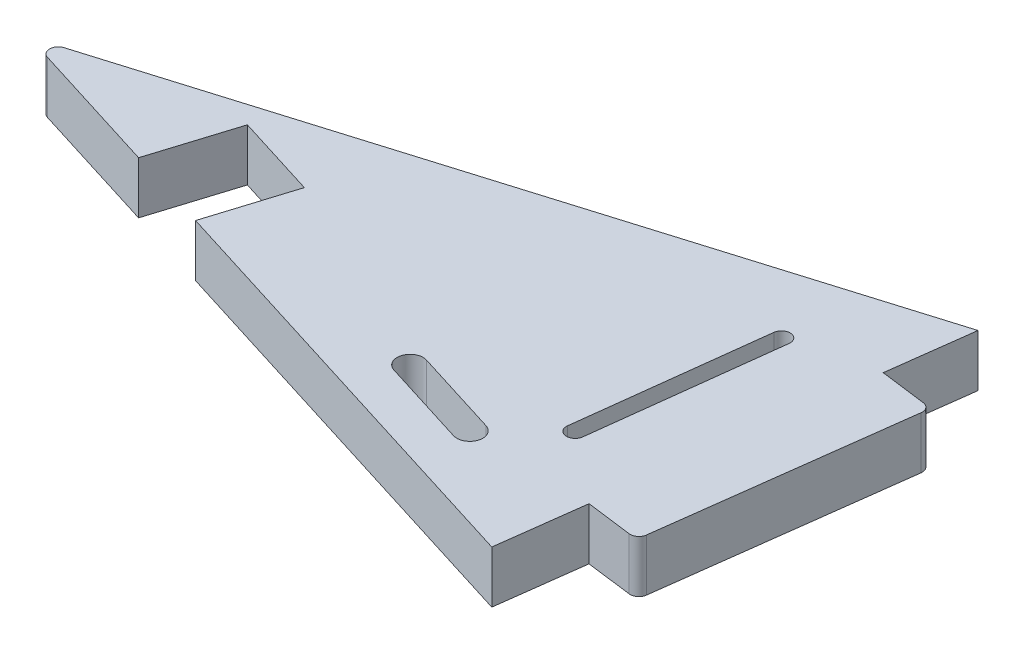
ISO-10303-21;
HEADER;
FILE_DESCRIPTION(('STEP AP214'),'2;1');
FILE_NAME('part.step','',(''),(''),'','','');
FILE_SCHEMA(('AUTOMOTIVE_DESIGN { 1 0 10303 214 1 1 1 1 }'));
ENDSEC;
DATA;
#1=APPLICATION_CONTEXT('core data for automotive mechanical design processes');
#2=APPLICATION_PROTOCOL_DEFINITION('international standard','automotive_design',2000,#1);
#3=PRODUCT_CONTEXT('',#1,'mechanical');
#4=PRODUCT('Part','Part','',(#3));
#5=PRODUCT_RELATED_PRODUCT_CATEGORY('part','',(#4));
#6=PRODUCT_DEFINITION_FORMATION('','',#4);
#7=PRODUCT_DEFINITION_CONTEXT('part definition',#1,'design');
#8=PRODUCT_DEFINITION('design','',#6,#7);
#9=PRODUCT_DEFINITION_SHAPE('','',#8);
#10=(LENGTH_UNIT() NAMED_UNIT(*) SI_UNIT(.MILLI.,.METRE.));
#11=(NAMED_UNIT(*) PLANE_ANGLE_UNIT() SI_UNIT($,.RADIAN.));
#12=(NAMED_UNIT(*) SI_UNIT($,.STERADIAN.) SOLID_ANGLE_UNIT());
#13=UNCERTAINTY_MEASURE_WITH_UNIT(LENGTH_MEASURE(1.E-05),#10,'distance_accuracy_value','');
#14=(GEOMETRIC_REPRESENTATION_CONTEXT(3) GLOBAL_UNCERTAINTY_ASSIGNED_CONTEXT((#13)) GLOBAL_UNIT_ASSIGNED_CONTEXT((#10,
#11,#12)) REPRESENTATION_CONTEXT('',''));
#15=CARTESIAN_POINT('',(0.,0.,0.));
#16=DIRECTION('',(0.,0.,1.));
#17=DIRECTION('',(1.,0.,0.));
#18=AXIS2_PLACEMENT_3D('',#15,#16,#17);
#19=CARTESIAN_POINT('',(-50.5622453656536,6.,-14.8094018421724));
#20=DIRECTION('',(0.298274993135946,0.,-0.95447997803503));
#21=DIRECTION('',(-0.95447997803503,0.,-0.298274993135946));
#22=AXIS2_PLACEMENT_3D('',#19,#20,#21);
#23=PLANE('',#22);
#24=DIRECTION('',(0.95447997803503,0.,0.298274993135946));
#25=VECTOR('',#24,1.);
#26=CARTESIAN_POINT('',(-50.5622453656536,0.,-14.8094018421724));
#27=LINE('',#26,#25);
#28=CARTESIAN_POINT('',(-77.0169682754077,0.,-23.0765027514706));
#29=VERTEX_POINT('',#28);
#30=CARTESIAN_POINT('',(-61.7452886268472,0.,-18.3041028612954));
#31=VERTEX_POINT('',#30);
#32=EDGE_CURVE('E315',#29,#31,#27,.T.);
#33=ORIENTED_EDGE('',*,*,#32,.T.);
#34=DIRECTION('',(0.,1.,0.));
#35=VECTOR('',#34,1.);
#36=CARTESIAN_POINT('',(-61.7452886268472,0.,-18.3041028612954));
#37=LINE('',#36,#35);
#38=CARTESIAN_POINT('',(-61.7452886268472,6.,-18.3041028612954));
#39=VERTEX_POINT('',#38);
#40=EDGE_CURVE('E217',#31,#39,#37,.T.);
#41=ORIENTED_EDGE('',*,*,#40,.T.);
#42=DIRECTION('',(0.95447997803503,0.,0.298274993135946));
#43=VECTOR('',#42,1.);
#44=CARTESIAN_POINT('',(-40.8702016635647,6.,-11.7806381852697));
#45=LINE('',#44,#43);
#46=CARTESIAN_POINT('',(-77.0169682754077,6.,-23.0765027514706));
#47=VERTEX_POINT('',#46);
#48=EDGE_CURVE('E281',#47,#39,#45,.T.);
#49=ORIENTED_EDGE('',*,*,#48,.F.);
#50=DIRECTION('',(0.,-1.,0.));
#51=VECTOR('',#50,1.);
#52=CARTESIAN_POINT('',(-77.0169682754077,6.,-23.0765027514706));
#53=LINE('',#52,#51);
#54=EDGE_CURVE('E329',#47,#29,#53,.T.);
#55=ORIENTED_EDGE('',*,*,#54,.T.);
#56=EDGE_LOOP('',(#33,#41,#49,#55));
#57=FACE_BOUND('',#56,.T.);
#58=ADVANCED_FACE('F33',(#57),#23,.F.);
#59=CARTESIAN_POINT('',(0.,6.,0.));
#60=DIRECTION('',(0.,1.,0.));
#61=DIRECTION('',(0.,0.,1.));
#62=AXIS2_PLACEMENT_3D('',#59,#60,#61);
#63=PLANE('',#62);
#64=DIRECTION('',(-0.298274993135947,0.,0.95447997803503));
#65=VECTOR('',#64,1.);
#66=CARTESIAN_POINT('',(-61.7452886268472,6.,-18.3041028612954));
#67=LINE('',#66,#65);
#68=CARTESIAN_POINT('',(-58.7625386954878,6.,-27.8489026416457));
#69=VERTEX_POINT('',#68);
#70=EDGE_CURVE('E208',#69,#39,#67,.T.);
#71=ORIENTED_EDGE('',*,*,#70,.F.);
#72=DIRECTION('',(-0.95447997803503,0.,-0.298274993135947));
#73=VECTOR('',#72,1.);
#74=CARTESIAN_POINT('',(-58.7625386954878,6.,-27.8489026416457));
#75=LINE('',#74,#73);
#76=CARTESIAN_POINT('',(-49.2177389151375,6.,-24.8661527102863));
#77=VERTEX_POINT('',#76);
#78=EDGE_CURVE('E210',#77,#69,#75,.T.);
#79=ORIENTED_EDGE('',*,*,#78,.F.);
#80=DIRECTION('',(0.298274993135947,0.,-0.95447997803503));
#81=VECTOR('',#80,1.);
#82=CARTESIAN_POINT('',(-49.2177389151375,6.,-24.8661527102863));
#83=LINE('',#82,#81);
#84=CARTESIAN_POINT('',(-52.2004888464969,6.,-15.321352929936));
#85=VERTEX_POINT('',#84);
#86=EDGE_CURVE('E188',#85,#77,#83,.T.);
#87=ORIENTED_EDGE('',*,*,#86,.F.);
#88=CARTESIAN_POINT('',(-2.58662904031351,6.,0.182978259496312));
#89=VERTEX_POINT('',#88);
#90=EDGE_CURVE('E285',#85,#89,#45,.T.);
#91=ORIENTED_EDGE('',*,*,#90,.T.);
#92=DIRECTION('',(0.127999816964584,0.,-0.991774191465493));
#93=VECTOR('',#92,1.);
#94=CARTESIAN_POINT('',(-2.58662904031351,6.,0.182978259496312));
#95=LINE('',#94,#93);
#96=CARTESIAN_POINT('',(-1.30663087066766,6.,-9.73476365515862));
#97=VERTEX_POINT('',#96);
#98=EDGE_CURVE('E284',#89,#97,#95,.T.);
#99=ORIENTED_EDGE('',*,*,#98,.T.);
#100=DIRECTION('',(0.991774191465493,0.,0.127999816964584));
#101=VECTOR('',#100,1.);
#102=CARTESIAN_POINT('',(4.99113524513822,6.,-8.92196481743351));
#103=LINE('',#102,#101);
#104=CARTESIAN_POINT('',(3.99935448218416,6.,-9.04996548252395));
#105=VERTEX_POINT('',#104);
#106=EDGE_CURVE('E287',#97,#105,#103,.T.);
#107=ORIENTED_EDGE('',*,*,#106,.T.);
#108=CARTESIAN_POINT('',(4.12735429914875,6.,-10.0417396739894));
#109=DIRECTION('',(0.,1.,0.));
#110=DIRECTION('',(0.,0.,1.));
#111=AXIS2_PLACEMENT_3D('',#108,#109,#110);
#112=CIRCLE('',#111,1.);
#113=CARTESIAN_POINT('',(5.11912933871551,6.,-9.91374642849446));
#114=VERTEX_POINT('',#113);
#115=EDGE_CURVE('E342',#105,#114,#112,.T.);
#116=ORIENTED_EDGE('',*,*,#115,.T.);
#117=DIRECTION('',(0.127993245494982,0.,-0.991775039566766));
#118=VECTOR('',#117,1.);
#119=CARTESIAN_POINT('',(8.86277670782997,6.,-38.9219648174335));
#120=LINE('',#119,#118);
#121=CARTESIAN_POINT('',(8.73478431041168,6.,-37.9301963493174));
#122=VERTEX_POINT('',#121);
#123=EDGE_CURVE('E290',#114,#122,#120,.T.);
#124=ORIENTED_EDGE('',*,*,#123,.T.);
#125=CARTESIAN_POINT('',(7.74300927084491,6.,-38.0581895948124));
#126=DIRECTION('',(0.,1.,0.));
#127=DIRECTION('',(0.,0.,1.));
#128=AXIS2_PLACEMENT_3D('',#125,#126,#127);
#129=CIRCLE('',#128,1.);
#130=CARTESIAN_POINT('',(7.8710090878095,6.,-39.0499637862779));
#131=VERTEX_POINT('',#130);
#132=EDGE_CURVE('E340',#122,#131,#129,.T.);
#133=ORIENTED_EDGE('',*,*,#132,.T.);
#134=DIRECTION('',(-0.991774191465493,0.,-0.127999816964585));
#135=VECTOR('',#134,1.);
#136=CARTESIAN_POINT('',(2.56520937097691,6.,-39.7347380004584));
#137=LINE('',#136,#135);
#138=CARTESIAN_POINT('',(2.56520937097691,6.,-39.7347380004584));
#139=VERTEX_POINT('',#138);
#140=EDGE_CURVE('E293',#131,#139,#137,.T.);
#141=ORIENTED_EDGE('',*,*,#140,.T.);
#142=DIRECTION('',(0.127999816964585,0.,-0.991774191465493));
#143=VECTOR('',#142,1.);
#144=CARTESIAN_POINT('',(2.56520937097691,6.,-39.7347380004584));
#145=LINE('',#144,#143);
#146=CARTESIAN_POINT('',(3.81336180791572,6.,-49.4057313137783));
#147=VERTEX_POINT('',#146);
#148=EDGE_CURVE('E295',#139,#147,#145,.T.);
#149=ORIENTED_EDGE('',*,*,#148,.T.);
#150=DIRECTION('',(-0.957266703629105,0.,0.289206601105625));
#151=VECTOR('',#150,1.);
#152=CARTESIAN_POINT('',(3.81336180791572,6.,-49.4057313137783));
#153=LINE('',#152,#151);
#154=CARTESIAN_POINT('',(-77.0078998833774,6.,-24.9882494331347));
#155=VERTEX_POINT('',#154);
#156=EDGE_CURVE('E297',#147,#155,#153,.T.);
#157=ORIENTED_EDGE('',*,*,#156,.T.);
#158=CARTESIAN_POINT('',(-76.7186932822718,6.,-24.0309827295056));
#159=DIRECTION('',(0.,1.,0.));
#160=DIRECTION('',(0.,0.,1.));
#161=AXIS2_PLACEMENT_3D('',#158,#159,#160);
#162=CIRCLE('',#161,1.);
#163=EDGE_CURVE('E344',#155,#47,#162,.T.);
#164=ORIENTED_EDGE('',*,*,#163,.T.);
#165=ORIENTED_EDGE('',*,*,#48,.T.);
#166=EDGE_LOOP('',(#71,#79,#87,#91,#99,#107,#116,#124,#133,#141,#149,#157,#164,#165));
#167=FACE_BOUND('',#166,.T.);
#168=CARTESIAN_POINT('',(-25.4485710643365,6.,-13.2733837193548));
#169=DIRECTION('',(0.,1.,0.));
#170=DIRECTION('',(0.,0.,1.));
#171=AXIS2_PLACEMENT_3D('',#168,#169,#170);
#172=CIRCLE('',#171,1.5);
#173=CARTESIAN_POINT('',(-25.0011585746325,6.,-14.7051036864073));
#174=VERTEX_POINT('',#173);
#175=CARTESIAN_POINT('',(-25.8959835540404,6.,-11.8416637523022));
#176=VERTEX_POINT('',#175);
#177=EDGE_CURVE('E48',#174,#176,#172,.T.);
#178=ORIENTED_EDGE('',*,*,#177,.F.);
#179=DIRECTION('',(-0.95447997803503,0.,-0.298274993135946));
#180=VECTOR('',#179,1.);
#181=CARTESIAN_POINT('',(-25.0011585746325,6.,-14.7051036864073));
#182=LINE('',#181,#180);
#183=CARTESIAN_POINT('',(-15.0011585746325,6.,-11.5801036864073));
#184=VERTEX_POINT('',#183);
#185=EDGE_CURVE('E227',#184,#174,#182,.T.);
#186=ORIENTED_EDGE('',*,*,#185,.F.);
#187=CARTESIAN_POINT('',(-15.4485710643365,6.,-10.1483837193548));
#188=DIRECTION('',(0.,1.,0.));
#189=DIRECTION('',(0.,0.,1.));
#190=AXIS2_PLACEMENT_3D('',#187,#188,#189);
#191=CIRCLE('',#190,1.5);
#192=CARTESIAN_POINT('',(-15.8959835540404,6.,-8.71666375230222));
#193=VERTEX_POINT('',#192);
#194=EDGE_CURVE('E239',#193,#184,#191,.T.);
#195=ORIENTED_EDGE('',*,*,#194,.F.);
#196=DIRECTION('',(0.95447997803503,0.,0.298274993135946));
#197=VECTOR('',#196,1.);
#198=CARTESIAN_POINT('',(-25.8959835540404,6.,-11.8416637523022));
#199=LINE('',#198,#197);
#200=EDGE_CURVE('E236',#176,#193,#199,.T.);
#201=ORIENTED_EDGE('',*,*,#200,.F.);
#202=EDGE_LOOP('',(#178,#186,#195,#201));
#203=FACE_BOUND('',#202,.T.);
#204=DIRECTION('',(-0.119933388837498,0.,0.992781940932627));
#205=VECTOR('',#204,1.);
#206=CARTESIAN_POINT('',(-7.75124107632382,6.,-37.4710303543429));
#207=LINE('',#206,#205);
#208=CARTESIAN_POINT('',(-7.75124107632382,6.,-37.4710303543429));
#209=VERTEX_POINT('',#208);
#210=CARTESIAN_POINT('',(-10.3126104313028,6.,-16.2685840270169));
#211=VERTEX_POINT('',#210);
#212=EDGE_CURVE('E252',#209,#211,#207,.T.);
#213=ORIENTED_EDGE('',*,*,#212,.F.);
#214=CARTESIAN_POINT('',(-6.75845913539119,6.,-37.3510969655054));
#215=DIRECTION('',(0.,1.,0.));
#216=DIRECTION('',(0.,0.,1.));
#217=AXIS2_PLACEMENT_3D('',#214,#215,#216);
#218=CIRCLE('',#217,1.);
#219=CARTESIAN_POINT('',(-5.76567719445857,6.,-37.2311635766679));
#220=VERTEX_POINT('',#219);
#221=EDGE_CURVE('E250',#220,#209,#218,.T.);
#222=ORIENTED_EDGE('',*,*,#221,.F.);
#223=DIRECTION('',(0.119933388837498,0.,-0.992781940932627));
#224=VECTOR('',#223,1.);
#225=CARTESIAN_POINT('',(-5.76567719445857,6.,-37.2311635766679));
#226=LINE('',#225,#224);
#227=CARTESIAN_POINT('',(-8.32704654943754,6.,-16.0287172493419));
#228=VERTEX_POINT('',#227);
#229=EDGE_CURVE('E258',#228,#220,#226,.T.);
#230=ORIENTED_EDGE('',*,*,#229,.F.);
#231=CARTESIAN_POINT('',(-9.31982849037016,6.,-16.1486506381794));
#232=DIRECTION('',(0.,1.,0.));
#233=DIRECTION('',(0.,0.,1.));
#234=AXIS2_PLACEMENT_3D('',#231,#232,#233);
#235=CIRCLE('',#234,1.);
#236=EDGE_CURVE('E255',#211,#228,#235,.T.);
#237=ORIENTED_EDGE('',*,*,#236,.F.);
#238=EDGE_LOOP('',(#213,#222,#230,#237));
#239=FACE_BOUND('',#238,.T.);
#240=ADVANCED_FACE('F359',(#167,#203,#239),#63,.T.);
#241=CARTESIAN_POINT('',(0.,0.,0.));
#242=DIRECTION('',(0.,1.,0.));
#243=DIRECTION('',(0.,0.,1.));
#244=AXIS2_PLACEMENT_3D('',#241,#242,#243);
#245=PLANE('',#244);
#246=DIRECTION('',(-0.95447997803503,0.,-0.298274993135946));
#247=VECTOR('',#246,1.);
#248=CARTESIAN_POINT('',(-25.0011585746325,0.,-14.7051036864073));
#249=LINE('',#248,#247);
#250=CARTESIAN_POINT('',(-15.0011585746325,0.,-11.5801036864073));
#251=VERTEX_POINT('',#250);
#252=CARTESIAN_POINT('',(-25.0011585746325,0.,-14.7051036864073));
#253=VERTEX_POINT('',#252);
#254=EDGE_CURVE('E231',#251,#253,#249,.T.);
#255=ORIENTED_EDGE('',*,*,#254,.T.);
#256=CARTESIAN_POINT('',(-25.4485710643365,0.,-13.2733837193548));
#257=DIRECTION('',(0.,1.,0.));
#258=DIRECTION('',(0.,0.,1.));
#259=AXIS2_PLACEMENT_3D('',#256,#257,#258);
#260=CIRCLE('',#259,1.5);
#261=CARTESIAN_POINT('',(-25.8959835540404,0.,-11.8416637523022));
#262=VERTEX_POINT('',#261);
#263=EDGE_CURVE('E223',#253,#262,#260,.T.);
#264=ORIENTED_EDGE('',*,*,#263,.T.);
#265=DIRECTION('',(0.95447997803503,0.,0.298274993135946));
#266=VECTOR('',#265,1.);
#267=CARTESIAN_POINT('',(-25.8959835540404,0.,-11.8416637523022));
#268=LINE('',#267,#266);
#269=CARTESIAN_POINT('',(-15.8959835540404,0.,-8.71666375230222));
#270=VERTEX_POINT('',#269);
#271=EDGE_CURVE('E226',#262,#270,#268,.T.);
#272=ORIENTED_EDGE('',*,*,#271,.T.);
#273=CARTESIAN_POINT('',(-15.4485710643365,0.,-10.1483837193548));
#274=DIRECTION('',(0.,1.,0.));
#275=DIRECTION('',(0.,0.,1.));
#276=AXIS2_PLACEMENT_3D('',#273,#274,#275);
#277=CIRCLE('',#276,1.5);
#278=EDGE_CURVE('E56',#270,#251,#277,.T.);
#279=ORIENTED_EDGE('',*,*,#278,.T.);
#280=EDGE_LOOP('',(#255,#264,#272,#279));
#281=FACE_BOUND('',#280,.T.);
#282=DIRECTION('',(-0.95447997803503,0.,-0.298274993135947));
#283=VECTOR('',#282,1.);
#284=CARTESIAN_POINT('',(-58.7625386954878,0.,-27.8489026416457));
#285=LINE('',#284,#283);
#286=CARTESIAN_POINT('',(-49.2177389151375,0.,-24.8661527102863));
#287=VERTEX_POINT('',#286);
#288=CARTESIAN_POINT('',(-58.7625386954878,0.,-27.8489026416457));
#289=VERTEX_POINT('',#288);
#290=EDGE_CURVE('E196',#287,#289,#285,.T.);
#291=ORIENTED_EDGE('',*,*,#290,.T.);
#292=DIRECTION('',(-0.298274993135947,0.,0.95447997803503));
#293=VECTOR('',#292,1.);
#294=CARTESIAN_POINT('',(-61.7452886268472,0.,-18.3041028612954));
#295=LINE('',#294,#293);
#296=EDGE_CURVE('E201',#289,#31,#295,.T.);
#297=ORIENTED_EDGE('',*,*,#296,.T.);
#298=ORIENTED_EDGE('',*,*,#32,.F.);
#299=CARTESIAN_POINT('',(-76.7186932822718,0.,-24.0309827295056));
#300=DIRECTION('',(0.,1.,0.));
#301=DIRECTION('',(0.,0.,1.));
#302=AXIS2_PLACEMENT_3D('',#299,#300,#301);
#303=CIRCLE('',#302,1.);
#304=CARTESIAN_POINT('',(-77.0078998833774,0.,-24.9882494331347));
#305=VERTEX_POINT('',#304);
#306=EDGE_CURVE('E336',#29,#305,#303,.F.);
#307=ORIENTED_EDGE('',*,*,#306,.T.);
#308=DIRECTION('',(-0.957266703629105,0.,0.289206601105625));
#309=VECTOR('',#308,1.);
#310=CARTESIAN_POINT('',(3.81336180791572,0.,-49.4057313137783));
#311=LINE('',#310,#309);
#312=CARTESIAN_POINT('',(3.81336180791572,0.,-49.4057313137783));
#313=VERTEX_POINT('',#312);
#314=EDGE_CURVE('E312',#313,#305,#311,.T.);
#315=ORIENTED_EDGE('',*,*,#314,.F.);
#316=DIRECTION('',(0.127999816964585,0.,-0.991774191465493));
#317=VECTOR('',#316,1.);
#318=CARTESIAN_POINT('',(2.56520937097691,0.,-39.7347380004584));
#319=LINE('',#318,#317);
#320=CARTESIAN_POINT('',(2.56520937097691,0.,-39.7347380004584));
#321=VERTEX_POINT('',#320);
#322=EDGE_CURVE('E310',#321,#313,#319,.T.);
#323=ORIENTED_EDGE('',*,*,#322,.F.);
#324=DIRECTION('',(-0.991774191465493,0.,-0.127999816964585));
#325=VECTOR('',#324,1.);
#326=CARTESIAN_POINT('',(2.56520937097691,0.,-39.7347380004584));
#327=LINE('',#326,#325);
#328=CARTESIAN_POINT('',(7.8710090878095,0.,-39.0499637862779));
#329=VERTEX_POINT('',#328);
#330=EDGE_CURVE('E308',#329,#321,#327,.T.);
#331=ORIENTED_EDGE('',*,*,#330,.F.);
#332=CARTESIAN_POINT('',(7.74300927084491,0.,-38.0581895948124));
#333=DIRECTION('',(0.,1.,0.));
#334=DIRECTION('',(0.,0.,1.));
#335=AXIS2_PLACEMENT_3D('',#332,#333,#334);
#336=CIRCLE('',#335,1.);
#337=CARTESIAN_POINT('',(8.73478431041168,0.,-37.9301963493174));
#338=VERTEX_POINT('',#337);
#339=EDGE_CURVE('E332',#329,#338,#336,.F.);
#340=ORIENTED_EDGE('',*,*,#339,.T.);
#341=DIRECTION('',(0.127993245494982,0.,-0.991775039566766));
#342=VECTOR('',#341,1.);
#343=CARTESIAN_POINT('',(8.86277670782997,0.,-38.9219648174335));
#344=LINE('',#343,#342);
#345=CARTESIAN_POINT('',(5.11912933871551,0.,-9.91374642849446));
#346=VERTEX_POINT('',#345);
#347=EDGE_CURVE('E305',#346,#338,#344,.T.);
#348=ORIENTED_EDGE('',*,*,#347,.F.);
#349=CARTESIAN_POINT('',(4.12735429914875,0.,-10.0417396739894));
#350=DIRECTION('',(0.,1.,0.));
#351=DIRECTION('',(0.,0.,1.));
#352=AXIS2_PLACEMENT_3D('',#349,#350,#351);
#353=CIRCLE('',#352,1.);
#354=CARTESIAN_POINT('',(3.99935448218416,0.,-9.04996548252395));
#355=VERTEX_POINT('',#354);
#356=EDGE_CURVE('E334',#346,#355,#353,.F.);
#357=ORIENTED_EDGE('',*,*,#356,.T.);
#358=DIRECTION('',(0.991774191465493,0.,0.127999816964584));
#359=VECTOR('',#358,1.);
#360=CARTESIAN_POINT('',(4.99113524513822,0.,-8.92196481743351));
#361=LINE('',#360,#359);
#362=CARTESIAN_POINT('',(-1.30663087066766,0.,-9.73476365515862));
#363=VERTEX_POINT('',#362);
#364=EDGE_CURVE('E302',#363,#355,#361,.T.);
#365=ORIENTED_EDGE('',*,*,#364,.F.);
#366=DIRECTION('',(0.127999816964584,0.,-0.991774191465493));
#367=VECTOR('',#366,1.);
#368=CARTESIAN_POINT('',(-2.58662904031351,0.,0.182978259496312));
#369=LINE('',#368,#367);
#370=CARTESIAN_POINT('',(-2.58662904031351,0.,0.182978259496312));
#371=VERTEX_POINT('',#370);
#372=EDGE_CURVE('E280',#371,#363,#369,.T.);
#373=ORIENTED_EDGE('',*,*,#372,.F.);
#374=CARTESIAN_POINT('',(-52.2004888464969,0.,-15.321352929936));
#375=VERTEX_POINT('',#374);
#376=EDGE_CURVE('E207',#375,#371,#27,.T.);
#377=ORIENTED_EDGE('',*,*,#376,.F.);
#378=DIRECTION('',(0.298274993135947,0.,-0.95447997803503));
#379=VECTOR('',#378,1.);
#380=CARTESIAN_POINT('',(-49.2177389151375,0.,-24.8661527102863));
#381=LINE('',#380,#379);
#382=EDGE_CURVE('E185',#375,#287,#381,.T.);
#383=ORIENTED_EDGE('',*,*,#382,.T.);
#384=EDGE_LOOP('',(#291,#297,#298,#307,#315,#323,#331,#340,#348,#357,#365,#373,#377,#383));
#385=FACE_BOUND('',#384,.T.);
#386=CARTESIAN_POINT('',(-6.75845913539119,0.,-37.3510969655054));
#387=DIRECTION('',(0.,1.,0.));
#388=DIRECTION('',(0.,0.,1.));
#389=AXIS2_PLACEMENT_3D('',#386,#387,#388);
#390=CIRCLE('',#389,1.);
#391=CARTESIAN_POINT('',(-5.76567719445857,0.,-37.2311635766679));
#392=VERTEX_POINT('',#391);
#393=CARTESIAN_POINT('',(-7.75124107632382,0.,-37.4710303543429));
#394=VERTEX_POINT('',#393);
#395=EDGE_CURVE('E220',#392,#394,#390,.T.);
#396=ORIENTED_EDGE('',*,*,#395,.T.);
#397=DIRECTION('',(-0.119933388837498,0.,0.992781940932627));
#398=VECTOR('',#397,1.);
#399=CARTESIAN_POINT('',(-7.75124107632382,0.,-37.4710303543429));
#400=LINE('',#399,#398);
#401=CARTESIAN_POINT('',(-10.3126104313028,0.,-16.2685840270169));
#402=VERTEX_POINT('',#401);
#403=EDGE_CURVE('E263',#394,#402,#400,.T.);
#404=ORIENTED_EDGE('',*,*,#403,.T.);
#405=CARTESIAN_POINT('',(-9.31982849037016,0.,-16.1486506381794));
#406=DIRECTION('',(0.,1.,0.));
#407=DIRECTION('',(0.,0.,1.));
#408=AXIS2_PLACEMENT_3D('',#405,#406,#407);
#409=CIRCLE('',#408,1.);
#410=CARTESIAN_POINT('',(-8.32704654943754,0.,-16.0287172493419));
#411=VERTEX_POINT('',#410);
#412=EDGE_CURVE('E266',#402,#411,#409,.T.);
#413=ORIENTED_EDGE('',*,*,#412,.T.);
#414=DIRECTION('',(0.119933388837498,0.,-0.992781940932627));
#415=VECTOR('',#414,1.);
#416=CARTESIAN_POINT('',(-5.76567719445857,0.,-37.2311635766679));
#417=LINE('',#416,#415);
#418=EDGE_CURVE('E253',#411,#392,#417,.T.);
#419=ORIENTED_EDGE('',*,*,#418,.T.);
#420=EDGE_LOOP('',(#396,#404,#413,#419));
#421=FACE_BOUND('',#420,.T.);
#422=ADVANCED_FACE('F204',(#281,#385,#421),#245,.F.);
#423=CARTESIAN_POINT('',(-2.58662904031351,6.,0.182978259496312));
#424=DIRECTION('',(-0.991774191465493,0.,-0.127999816964584));
#425=DIRECTION('',(-0.127999816964584,0.,0.991774191465493));
#426=AXIS2_PLACEMENT_3D('',#423,#424,#425);
#427=PLANE('',#426);
#428=ORIENTED_EDGE('',*,*,#372,.T.);
#429=DIRECTION('',(0.,-1.,0.));
#430=VECTOR('',#429,1.);
#431=CARTESIAN_POINT('',(-1.30663087066766,6.,-9.73476365515862));
#432=LINE('',#431,#430);
#433=EDGE_CURVE('E323',#97,#363,#432,.T.);
#434=ORIENTED_EDGE('',*,*,#433,.F.);
#435=ORIENTED_EDGE('',*,*,#98,.F.);
#436=DIRECTION('',(0.,-1.,0.));
#437=VECTOR('',#436,1.);
#438=CARTESIAN_POINT('',(-2.58662904031351,6.,0.182978259496312));
#439=LINE('',#438,#437);
#440=EDGE_CURVE('E326',#89,#371,#439,.T.);
#441=ORIENTED_EDGE('',*,*,#440,.T.);
#442=EDGE_LOOP('',(#428,#434,#435,#441));
#443=FACE_BOUND('',#442,.T.);
#444=ADVANCED_FACE('F402',(#443),#427,.F.);
#445=CARTESIAN_POINT('',(4.99113524513822,6.,-8.92196481743351));
#446=DIRECTION('',(0.127999816964584,0.,-0.991774191465493));
#447=DIRECTION('',(-0.991774191465493,0.,-0.127999816964584));
#448=AXIS2_PLACEMENT_3D('',#445,#446,#447);
#449=PLANE('',#448);
#450=ORIENTED_EDGE('',*,*,#364,.T.);
#451=DIRECTION('',(0.,-1.,0.));
#452=VECTOR('',#451,1.);
#453=CARTESIAN_POINT('',(3.99935448218416,6.,-9.04996548252395));
#454=LINE('',#453,#452);
#455=EDGE_CURVE('E41',#355,#105,#454,.F.);
#456=ORIENTED_EDGE('',*,*,#455,.T.);
#457=ORIENTED_EDGE('',*,*,#106,.F.);
#458=ORIENTED_EDGE('',*,*,#433,.T.);
#459=EDGE_LOOP('',(#450,#456,#457,#458));
#460=FACE_BOUND('',#459,.T.);
#461=ADVANCED_FACE('F353',(#460),#449,.F.);
#462=CARTESIAN_POINT('',(8.86277670782997,6.,-38.9219648174335));
#463=DIRECTION('',(-0.991775039566766,0.,-0.127993245494982));
#464=DIRECTION('',(-0.127993245494982,0.,0.991775039566767));
#465=AXIS2_PLACEMENT_3D('',#462,#463,#464);
#466=PLANE('',#465);
#467=ORIENTED_EDGE('',*,*,#123,.F.);
#468=DIRECTION('',(0.,-1.,0.));
#469=VECTOR('',#468,1.);
#470=CARTESIAN_POINT('',(5.11912933871551,6.,-9.91374642849446));
#471=LINE('',#470,#469);
#472=EDGE_CURVE('E348',#114,#346,#471,.T.);
#473=ORIENTED_EDGE('',*,*,#472,.T.);
#474=ORIENTED_EDGE('',*,*,#347,.T.);
#475=DIRECTION('',(0.,-1.,0.));
#476=VECTOR('',#475,1.);
#477=CARTESIAN_POINT('',(8.73478431041168,6.,-37.9301963493174));
#478=LINE('',#477,#476);
#479=EDGE_CURVE('E346',#338,#122,#478,.F.);
#480=ORIENTED_EDGE('',*,*,#479,.T.);
#481=EDGE_LOOP('',(#467,#473,#474,#480));
#482=FACE_BOUND('',#481,.T.);
#483=ADVANCED_FACE('F368',(#482),#466,.F.);
#484=CARTESIAN_POINT('',(2.56520937097691,6.,-39.7347380004584));
#485=DIRECTION('',(-0.127999816964585,0.,0.991774191465493));
#486=DIRECTION('',(0.991774191465493,0.,0.127999816964585));
#487=AXIS2_PLACEMENT_3D('',#484,#485,#486);
#488=PLANE('',#487);
#489=ORIENTED_EDGE('',*,*,#140,.F.);
#490=DIRECTION('',(0.,-1.,0.));
#491=VECTOR('',#490,1.);
#492=CARTESIAN_POINT('',(7.8710090878095,6.,-39.0499637862779));
#493=LINE('',#492,#491);
#494=EDGE_CURVE('E11',#131,#329,#493,.T.);
#495=ORIENTED_EDGE('',*,*,#494,.T.);
#496=ORIENTED_EDGE('',*,*,#330,.T.);
#497=DIRECTION('',(0.,-1.,0.));
#498=VECTOR('',#497,1.);
#499=CARTESIAN_POINT('',(2.56520937097691,6.,-39.7347380004584));
#500=LINE('',#499,#498);
#501=EDGE_CURVE('E320',#139,#321,#500,.T.);
#502=ORIENTED_EDGE('',*,*,#501,.F.);
#503=EDGE_LOOP('',(#489,#495,#496,#502));
#504=FACE_BOUND('',#503,.T.);
#505=ADVANCED_FACE('F377',(#504),#488,.F.);
#506=CARTESIAN_POINT('',(2.56520937097691,6.,-39.7347380004584));
#507=DIRECTION('',(-0.991774191465493,0.,-0.127999816964585));
#508=DIRECTION('',(-0.127999816964585,0.,0.991774191465493));
#509=AXIS2_PLACEMENT_3D('',#506,#507,#508);
#510=PLANE('',#509);
#511=ORIENTED_EDGE('',*,*,#322,.T.);
#512=DIRECTION('',(0.,-1.,0.));
#513=VECTOR('',#512,1.);
#514=CARTESIAN_POINT('',(3.81336180791572,6.,-49.4057313137783));
#515=LINE('',#514,#513);
#516=EDGE_CURVE('E300',#147,#313,#515,.T.);
#517=ORIENTED_EDGE('',*,*,#516,.F.);
#518=ORIENTED_EDGE('',*,*,#148,.F.);
#519=ORIENTED_EDGE('',*,*,#501,.T.);
#520=EDGE_LOOP('',(#511,#517,#518,#519));
#521=FACE_BOUND('',#520,.T.);
#522=ADVANCED_FACE('F384',(#521),#510,.F.);
#523=CARTESIAN_POINT('',(3.81336180791572,6.,-49.4057313137783));
#524=DIRECTION('',(0.289206601105625,0.,0.957266703629104));
#525=DIRECTION('',(0.957266703629105,0.,-0.289206601105625));
#526=AXIS2_PLACEMENT_3D('',#523,#524,#525);
#527=PLANE('',#526);
#528=ORIENTED_EDGE('',*,*,#314,.T.);
#529=DIRECTION('',(0.,-1.,0.));
#530=VECTOR('',#529,1.);
#531=CARTESIAN_POINT('',(-77.0078998833774,6.,-24.9882494331347));
#532=LINE('',#531,#530);
#533=EDGE_CURVE('E338',#305,#155,#532,.F.);
#534=ORIENTED_EDGE('',*,*,#533,.T.);
#535=ORIENTED_EDGE('',*,*,#156,.F.);
#536=ORIENTED_EDGE('',*,*,#516,.T.);
#537=EDGE_LOOP('',(#528,#534,#535,#536));
#538=FACE_BOUND('',#537,.T.);
#539=ADVANCED_FACE('F387',(#538),#527,.F.);
#540=ORIENTED_EDGE('',*,*,#90,.F.);
#541=DIRECTION('',(0.,1.,0.));
#542=VECTOR('',#541,1.);
#543=CARTESIAN_POINT('',(-52.2004888464969,0.,-15.321352929936));
#544=LINE('',#543,#542);
#545=EDGE_CURVE('E193',#375,#85,#544,.T.);
#546=ORIENTED_EDGE('',*,*,#545,.F.);
#547=ORIENTED_EDGE('',*,*,#376,.T.);
#548=ORIENTED_EDGE('',*,*,#440,.F.);
#549=EDGE_LOOP('',(#540,#546,#547,#548));
#550=FACE_BOUND('',#549,.T.);
#551=ADVANCED_FACE('F400',(#550),#23,.F.);
#552=CARTESIAN_POINT('',(-6.75845913539119,6.,-37.3510969655054));
#553=DIRECTION('',(0.,-1.,0.));
#554=DIRECTION('',(0.,0.,-1.));
#555=AXIS2_PLACEMENT_3D('',#552,#553,#554);
#556=CYLINDRICAL_SURFACE('',#555,1.);
#557=ORIENTED_EDGE('',*,*,#395,.F.);
#558=DIRECTION('',(0.,-1.,0.));
#559=VECTOR('',#558,1.);
#560=CARTESIAN_POINT('',(-5.76567719445857,6.,-37.2311635766679));
#561=LINE('',#560,#559);
#562=EDGE_CURVE('E260',#220,#392,#561,.T.);
#563=ORIENTED_EDGE('',*,*,#562,.F.);
#564=ORIENTED_EDGE('',*,*,#221,.T.);
#565=DIRECTION('',(0.,-1.,0.));
#566=VECTOR('',#565,1.);
#567=CARTESIAN_POINT('',(-7.75124107632382,6.,-37.4710303543429));
#568=LINE('',#567,#566);
#569=EDGE_CURVE('E277',#209,#394,#568,.T.);
#570=ORIENTED_EDGE('',*,*,#569,.T.);
#571=EDGE_LOOP('',(#557,#563,#564,#570));
#572=FACE_BOUND('',#571,.T.);
#573=ADVANCED_FACE('F421',(#572),#556,.F.);
#574=CARTESIAN_POINT('',(-7.75124107632382,6.,-37.4710303543429));
#575=DIRECTION('',(0.992781940932627,0.,0.119933388837498));
#576=DIRECTION('',(0.119933388837498,0.,-0.992781940932627));
#577=AXIS2_PLACEMENT_3D('',#574,#575,#576);
#578=PLANE('',#577);
#579=ORIENTED_EDGE('',*,*,#403,.F.);
#580=ORIENTED_EDGE('',*,*,#569,.F.);
#581=ORIENTED_EDGE('',*,*,#212,.T.);
#582=DIRECTION('',(0.,-1.,0.));
#583=VECTOR('',#582,1.);
#584=CARTESIAN_POINT('',(-10.3126104313028,6.,-16.2685840270169));
#585=LINE('',#584,#583);
#586=EDGE_CURVE('E275',#211,#402,#585,.T.);
#587=ORIENTED_EDGE('',*,*,#586,.T.);
#588=EDGE_LOOP('',(#579,#580,#581,#587));
#589=FACE_BOUND('',#588,.T.);
#590=ADVANCED_FACE('F426',(#589),#578,.T.);
#591=CARTESIAN_POINT('',(-9.31982849037016,6.,-16.1486506381794));
#592=DIRECTION('',(0.,-1.,0.));
#593=DIRECTION('',(0.,0.,-1.));
#594=AXIS2_PLACEMENT_3D('',#591,#592,#593);
#595=CYLINDRICAL_SURFACE('',#594,1.);
#596=ORIENTED_EDGE('',*,*,#412,.F.);
#597=ORIENTED_EDGE('',*,*,#586,.F.);
#598=ORIENTED_EDGE('',*,*,#236,.T.);
#599=DIRECTION('',(0.,-1.,0.));
#600=VECTOR('',#599,1.);
#601=CARTESIAN_POINT('',(-8.32704654943754,6.,-16.0287172493419));
#602=LINE('',#601,#600);
#603=EDGE_CURVE('E273',#228,#411,#602,.T.);
#604=ORIENTED_EDGE('',*,*,#603,.T.);
#605=EDGE_LOOP('',(#596,#597,#598,#604));
#606=FACE_BOUND('',#605,.T.);
#607=ADVANCED_FACE('F468',(#606),#595,.F.);
#608=CARTESIAN_POINT('',(-5.76567719445857,6.,-37.2311635766679));
#609=DIRECTION('',(-0.992781940932627,0.,-0.119933388837498));
#610=DIRECTION('',(-0.119933388837498,0.,0.992781940932627));
#611=AXIS2_PLACEMENT_3D('',#608,#609,#610);
#612=PLANE('',#611);
#613=ORIENTED_EDGE('',*,*,#418,.F.);
#614=ORIENTED_EDGE('',*,*,#603,.F.);
#615=ORIENTED_EDGE('',*,*,#229,.T.);
#616=ORIENTED_EDGE('',*,*,#562,.T.);
#617=EDGE_LOOP('',(#613,#614,#615,#616));
#618=FACE_BOUND('',#617,.T.);
#619=ADVANCED_FACE('F478',(#618),#612,.T.);
#620=CARTESIAN_POINT('',(-76.7186932822718,6.,-24.0309827295056));
#621=DIRECTION('',(0.,-1.,0.));
#622=DIRECTION('',(0.,0.,-1.));
#623=AXIS2_PLACEMENT_3D('',#620,#621,#622);
#624=CYLINDRICAL_SURFACE('',#623,1.);
#625=ORIENTED_EDGE('',*,*,#163,.F.);
#626=ORIENTED_EDGE('',*,*,#533,.F.);
#627=ORIENTED_EDGE('',*,*,#306,.F.);
#628=ORIENTED_EDGE('',*,*,#54,.F.);
#629=EDGE_LOOP('',(#625,#626,#627,#628));
#630=FACE_BOUND('',#629,.T.);
#631=ADVANCED_FACE('F390',(#630),#624,.T.);
#632=CARTESIAN_POINT('',(4.12735429914875,6.,-10.0417396739894));
#633=DIRECTION('',(0.,-1.,0.));
#634=DIRECTION('',(0.,0.,-1.));
#635=AXIS2_PLACEMENT_3D('',#632,#633,#634);
#636=CYLINDRICAL_SURFACE('',#635,1.);
#637=ORIENTED_EDGE('',*,*,#115,.F.);
#638=ORIENTED_EDGE('',*,*,#455,.F.);
#639=ORIENTED_EDGE('',*,*,#356,.F.);
#640=ORIENTED_EDGE('',*,*,#472,.F.);
#641=EDGE_LOOP('',(#637,#638,#639,#640));
#642=FACE_BOUND('',#641,.T.);
#643=ADVANCED_FACE('F365',(#642),#636,.T.);
#644=CARTESIAN_POINT('',(7.74300927084491,6.,-38.0581895948124));
#645=DIRECTION('',(0.,-1.,0.));
#646=DIRECTION('',(0.,0.,-1.));
#647=AXIS2_PLACEMENT_3D('',#644,#645,#646);
#648=CYLINDRICAL_SURFACE('',#647,1.);
#649=ORIENTED_EDGE('',*,*,#132,.F.);
#650=ORIENTED_EDGE('',*,*,#479,.F.);
#651=ORIENTED_EDGE('',*,*,#339,.F.);
#652=ORIENTED_EDGE('',*,*,#494,.F.);
#653=EDGE_LOOP('',(#649,#650,#651,#652));
#654=FACE_BOUND('',#653,.T.);
#655=ADVANCED_FACE('F35',(#654),#648,.T.);
#656=CARTESIAN_POINT('',(-61.7452886268472,0.,-18.3041028612954));
#657=DIRECTION('',(-0.95447997803503,0.,-0.298274993135947));
#658=DIRECTION('',(-0.298274993135947,0.,0.95447997803503));
#659=AXIS2_PLACEMENT_3D('',#656,#657,#658);
#660=PLANE('',#659);
#661=ORIENTED_EDGE('',*,*,#70,.T.);
#662=ORIENTED_EDGE('',*,*,#40,.F.);
#663=ORIENTED_EDGE('',*,*,#296,.F.);
#664=DIRECTION('',(0.,1.,0.));
#665=VECTOR('',#664,1.);
#666=CARTESIAN_POINT('',(-58.7625386954878,0.,-27.8489026416457));
#667=LINE('',#666,#665);
#668=EDGE_CURVE('E192',#289,#69,#667,.T.);
#669=ORIENTED_EDGE('',*,*,#668,.T.);
#670=EDGE_LOOP('',(#661,#662,#663,#669));
#671=FACE_BOUND('',#670,.T.);
#672=ADVANCED_FACE('F396',(#671),#660,.F.);
#673=CARTESIAN_POINT('',(-58.7625386954878,0.,-27.8489026416457));
#674=DIRECTION('',(0.298274993135947,0.,-0.95447997803503));
#675=DIRECTION('',(-0.95447997803503,0.,-0.298274993135947));
#676=AXIS2_PLACEMENT_3D('',#673,#674,#675);
#677=PLANE('',#676);
#678=ORIENTED_EDGE('',*,*,#78,.T.);
#679=ORIENTED_EDGE('',*,*,#668,.F.);
#680=ORIENTED_EDGE('',*,*,#290,.F.);
#681=DIRECTION('',(0.,1.,0.));
#682=VECTOR('',#681,1.);
#683=CARTESIAN_POINT('',(-49.2177389151375,0.,-24.8661527102863));
#684=LINE('',#683,#682);
#685=EDGE_CURVE('E181',#287,#77,#684,.T.);
#686=ORIENTED_EDGE('',*,*,#685,.T.);
#687=EDGE_LOOP('',(#678,#679,#680,#686));
#688=FACE_BOUND('',#687,.T.);
#689=ADVANCED_FACE('F197',(#688),#677,.F.);
#690=CARTESIAN_POINT('',(-49.2177389151375,0.,-24.8661527102863));
#691=DIRECTION('',(0.95447997803503,0.,0.298274993135947));
#692=DIRECTION('',(0.298274993135947,0.,-0.95447997803503));
#693=AXIS2_PLACEMENT_3D('',#690,#691,#692);
#694=PLANE('',#693);
#695=ORIENTED_EDGE('',*,*,#86,.T.);
#696=ORIENTED_EDGE('',*,*,#685,.F.);
#697=ORIENTED_EDGE('',*,*,#382,.F.);
#698=ORIENTED_EDGE('',*,*,#545,.T.);
#699=EDGE_LOOP('',(#695,#696,#697,#698));
#700=FACE_BOUND('',#699,.T.);
#701=ADVANCED_FACE('F183',(#700),#694,.F.);
#702=CARTESIAN_POINT('',(-25.4485710643365,0.,-13.2733837193548));
#703=DIRECTION('',(0.,1.,0.));
#704=DIRECTION('',(0.,0.,1.));
#705=AXIS2_PLACEMENT_3D('',#702,#703,#704);
#706=CYLINDRICAL_SURFACE('',#705,1.5);
#707=ORIENTED_EDGE('',*,*,#177,.T.);
#708=DIRECTION('',(0.,1.,0.));
#709=VECTOR('',#708,1.);
#710=CARTESIAN_POINT('',(-25.8959835540404,0.,-11.8416637523022));
#711=LINE('',#710,#709);
#712=EDGE_CURVE('E234',#262,#176,#711,.T.);
#713=ORIENTED_EDGE('',*,*,#712,.F.);
#714=ORIENTED_EDGE('',*,*,#263,.F.);
#715=DIRECTION('',(0.,1.,0.));
#716=VECTOR('',#715,1.);
#717=CARTESIAN_POINT('',(-25.0011585746325,0.,-14.7051036864073));
#718=LINE('',#717,#716);
#719=EDGE_CURVE('E215',#253,#174,#718,.T.);
#720=ORIENTED_EDGE('',*,*,#719,.T.);
#721=EDGE_LOOP('',(#707,#713,#714,#720));
#722=FACE_BOUND('',#721,.T.);
#723=ADVANCED_FACE('F573',(#722),#706,.F.);
#724=CARTESIAN_POINT('',(-25.0011585746325,0.,-14.7051036864073));
#725=DIRECTION('',(0.298274993135946,0.,-0.95447997803503));
#726=DIRECTION('',(-0.95447997803503,0.,-0.298274993135946));
#727=AXIS2_PLACEMENT_3D('',#724,#725,#726);
#728=PLANE('',#727);
#729=ORIENTED_EDGE('',*,*,#185,.T.);
#730=ORIENTED_EDGE('',*,*,#719,.F.);
#731=ORIENTED_EDGE('',*,*,#254,.F.);
#732=DIRECTION('',(0.,1.,0.));
#733=VECTOR('',#732,1.);
#734=CARTESIAN_POINT('',(-15.0011585746325,0.,-11.5801036864073));
#735=LINE('',#734,#733);
#736=EDGE_CURVE('E245',#251,#184,#735,.T.);
#737=ORIENTED_EDGE('',*,*,#736,.T.);
#738=EDGE_LOOP('',(#729,#730,#731,#737));
#739=FACE_BOUND('',#738,.T.);
#740=ADVANCED_FACE('F582',(#739),#728,.F.);
#741=CARTESIAN_POINT('',(-15.4485710643365,0.,-10.1483837193548));
#742=DIRECTION('',(0.,1.,0.));
#743=DIRECTION('',(0.,0.,1.));
#744=AXIS2_PLACEMENT_3D('',#741,#742,#743);
#745=CYLINDRICAL_SURFACE('',#744,1.5);
#746=ORIENTED_EDGE('',*,*,#194,.T.);
#747=ORIENTED_EDGE('',*,*,#736,.F.);
#748=ORIENTED_EDGE('',*,*,#278,.F.);
#749=DIRECTION('',(0.,1.,0.));
#750=VECTOR('',#749,1.);
#751=CARTESIAN_POINT('',(-15.8959835540404,0.,-8.71666375230222));
#752=LINE('',#751,#750);
#753=EDGE_CURVE('E247',#270,#193,#752,.T.);
#754=ORIENTED_EDGE('',*,*,#753,.T.);
#755=EDGE_LOOP('',(#746,#747,#748,#754));
#756=FACE_BOUND('',#755,.T.);
#757=ADVANCED_FACE('F591',(#756),#745,.F.);
#758=CARTESIAN_POINT('',(-25.8959835540404,0.,-11.8416637523022));
#759=DIRECTION('',(-0.298274993135946,0.,0.95447997803503));
#760=DIRECTION('',(0.95447997803503,0.,0.298274993135946));
#761=AXIS2_PLACEMENT_3D('',#758,#759,#760);
#762=PLANE('',#761);
#763=ORIENTED_EDGE('',*,*,#200,.T.);
#764=ORIENTED_EDGE('',*,*,#753,.F.);
#765=ORIENTED_EDGE('',*,*,#271,.F.);
#766=ORIENTED_EDGE('',*,*,#712,.T.);
#767=EDGE_LOOP('',(#763,#764,#765,#766));
#768=FACE_BOUND('',#767,.T.);
#769=ADVANCED_FACE('F601',(#768),#762,.F.);
#770=CLOSED_SHELL('',(#58,#240,#422,#444,#461,#483,#505,#522,#539,#551,#573,#590,#607,#619,#631,
#643,#655,#672,#689,#701,#723,#740,#757,#769));
#771=MANIFOLD_SOLID_BREP('B2',#770);
#772=ADVANCED_BREP_SHAPE_REPRESENTATION('',(#18,#771),#14);
#773=SHAPE_DEFINITION_REPRESENTATION(#9,#772);
ENDSEC;
END-ISO-10303-21;
